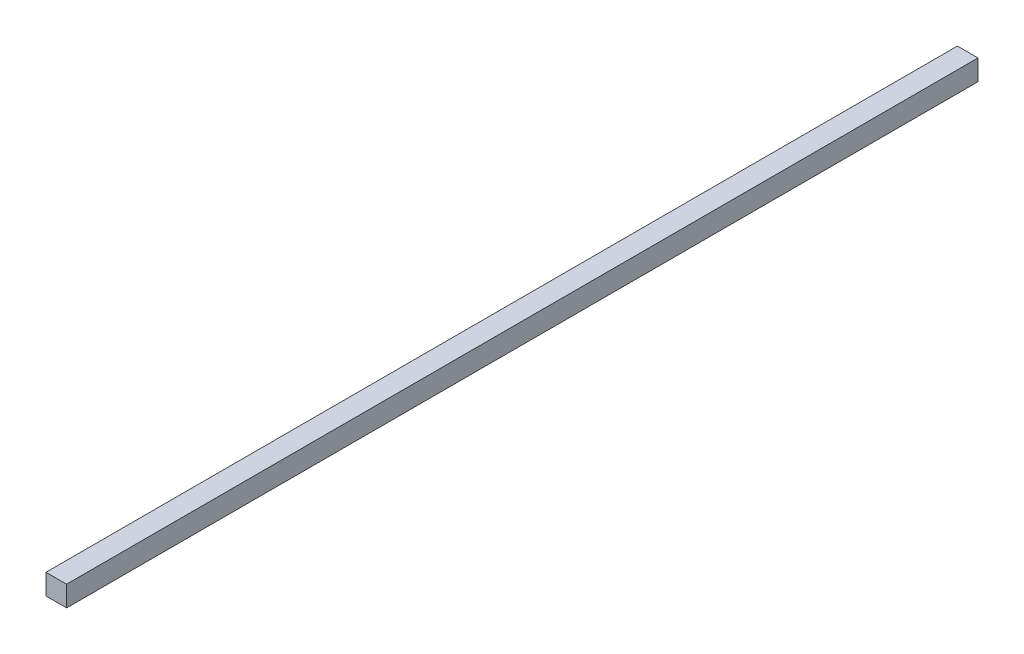
ISO-10303-21;
HEADER;
FILE_DESCRIPTION(('STEP AP214'),'2;1');
FILE_NAME('part.step','',(''),(''),'','','');
FILE_SCHEMA(('AUTOMOTIVE_DESIGN { 1 0 10303 214 1 1 1 1 }'));
ENDSEC;
DATA;
#1=APPLICATION_CONTEXT('core data for automotive mechanical design processes');
#2=APPLICATION_PROTOCOL_DEFINITION('international standard','automotive_design',2000,#1);
#3=PRODUCT_CONTEXT('',#1,'mechanical');
#4=PRODUCT('Part','Part','',(#3));
#5=PRODUCT_RELATED_PRODUCT_CATEGORY('part','',(#4));
#6=PRODUCT_DEFINITION_FORMATION('','',#4);
#7=PRODUCT_DEFINITION_CONTEXT('part definition',#1,'design');
#8=PRODUCT_DEFINITION('design','',#6,#7);
#9=PRODUCT_DEFINITION_SHAPE('','',#8);
#10=(LENGTH_UNIT() NAMED_UNIT(*) SI_UNIT(.MILLI.,.METRE.));
#11=(NAMED_UNIT(*) PLANE_ANGLE_UNIT() SI_UNIT($,.RADIAN.));
#12=(NAMED_UNIT(*) SI_UNIT($,.STERADIAN.) SOLID_ANGLE_UNIT());
#13=UNCERTAINTY_MEASURE_WITH_UNIT(LENGTH_MEASURE(1.E-05),#10,'distance_accuracy_value','');
#14=(GEOMETRIC_REPRESENTATION_CONTEXT(3) GLOBAL_UNCERTAINTY_ASSIGNED_CONTEXT((#13)) GLOBAL_UNIT_ASSIGNED_CONTEXT((#10,
#11,#12)) REPRESENTATION_CONTEXT('',''));
#15=CARTESIAN_POINT('',(0.,0.,0.));
#16=DIRECTION('',(0.,0.,1.));
#17=DIRECTION('',(1.,0.,0.));
#18=AXIS2_PLACEMENT_3D('',#15,#16,#17);
#19=CARTESIAN_POINT('',(744.799999999998,-44.4500000000014,2319.74204896855));
#20=DIRECTION('',(-1.,0.,0.));
#21=DIRECTION('',(0.,0.,1.));
#22=AXIS2_PLACEMENT_3D('',#19,#20,#21);
#23=PLANE('',#22);
#24=DIRECTION('',(0.,1.,0.));
#25=VECTOR('',#24,1.);
#26=CARTESIAN_POINT('',(744.799999999998,-44.4500000000012,2247.9));
#27=LINE('',#26,#25);
#28=CARTESIAN_POINT('',(744.799999999998,-44.4500000000006,2247.9));
#29=VERTEX_POINT('',#28);
#30=CARTESIAN_POINT('',(744.799999999998,6.34999999999861,2247.9));
#31=VERTEX_POINT('',#30);
#32=EDGE_CURVE('E102',#29,#31,#27,.T.);
#33=ORIENTED_EDGE('',*,*,#32,.F.);
#34=DIRECTION('',(0.,0.,-1.));
#35=VECTOR('',#34,1.);
#36=CARTESIAN_POINT('',(744.799999999998,-44.4500000000014,2319.74204896855));
#37=LINE('',#36,#35);
#38=CARTESIAN_POINT('',(744.799999999998,-44.4500000000014,0.));
#39=VERTEX_POINT('',#38);
#40=EDGE_CURVE('E92',#29,#39,#37,.T.);
#41=ORIENTED_EDGE('',*,*,#40,.T.);
#42=DIRECTION('',(0.,1.,0.));
#43=VECTOR('',#42,1.);
#44=CARTESIAN_POINT('',(744.799999999998,-44.4500000000014,0.));
#45=LINE('',#44,#43);
#46=CARTESIAN_POINT('',(744.799999999998,6.34999999999861,0.));
#47=VERTEX_POINT('',#46);
#48=EDGE_CURVE('E83',#39,#47,#45,.T.);
#49=ORIENTED_EDGE('',*,*,#48,.T.);
#50=DIRECTION('',(0.,0.,-1.));
#51=VECTOR('',#50,1.);
#52=CARTESIAN_POINT('',(744.799999999998,6.34999999999861,2319.74204896855));
#53=LINE('',#52,#51);
#54=EDGE_CURVE('E74',#31,#47,#53,.T.);
#55=ORIENTED_EDGE('',*,*,#54,.F.);
#56=EDGE_LOOP('',(#33,#41,#49,#55));
#57=FACE_BOUND('',#56,.T.);
#58=ADVANCED_FACE('F33',(#57),#23,.F.);
#59=CARTESIAN_POINT('',(744.799999999998,6.34999999999861,2319.74204896855));
#60=DIRECTION('',(0.,-1.,0.));
#61=DIRECTION('',(1.,0.,0.));
#62=AXIS2_PLACEMENT_3D('',#59,#60,#61);
#63=PLANE('',#62);
#64=DIRECTION('',(-1.,0.,0.));
#65=VECTOR('',#64,1.);
#66=CARTESIAN_POINT('',(744.799999999998,6.34999999999861,2247.9));
#67=LINE('',#66,#65);
#68=CARTESIAN_POINT('',(693.999999999998,6.34999999999861,2247.9));
#69=VERTEX_POINT('',#68);
#70=EDGE_CURVE('E80',#31,#69,#67,.T.);
#71=ORIENTED_EDGE('',*,*,#70,.F.);
#72=ORIENTED_EDGE('',*,*,#54,.T.);
#73=DIRECTION('',(-1.,0.,0.));
#74=VECTOR('',#73,1.);
#75=CARTESIAN_POINT('',(744.799999999998,6.34999999999861,0.));
#76=LINE('',#75,#74);
#77=CARTESIAN_POINT('',(693.999999999998,6.34999999999861,0.));
#78=VERTEX_POINT('',#77);
#79=EDGE_CURVE('E77',#47,#78,#76,.T.);
#80=ORIENTED_EDGE('',*,*,#79,.T.);
#81=DIRECTION('',(0.,0.,-1.));
#82=VECTOR('',#81,1.);
#83=CARTESIAN_POINT('',(693.999999999998,6.34999999999861,2319.74204896855));
#84=LINE('',#83,#82);
#85=EDGE_CURVE('E68',#69,#78,#84,.T.);
#86=ORIENTED_EDGE('',*,*,#85,.F.);
#87=EDGE_LOOP('',(#71,#72,#80,#86));
#88=FACE_BOUND('',#87,.T.);
#89=ADVANCED_FACE('F76',(#88),#63,.F.);
#90=CARTESIAN_POINT('',(693.999999999998,-44.4500000000014,2319.74204896855));
#91=DIRECTION('',(1.,0.,0.));
#92=DIRECTION('',(0.,0.,-1.));
#93=AXIS2_PLACEMENT_3D('',#90,#91,#92);
#94=PLANE('',#93);
#95=DIRECTION('',(0.,-1.,0.));
#96=VECTOR('',#95,1.);
#97=CARTESIAN_POINT('',(693.999999999998,-44.4500000000012,2247.9));
#98=LINE('',#97,#96);
#99=CARTESIAN_POINT('',(693.999999999998,-44.4500000000014,2247.9));
#100=VERTEX_POINT('',#99);
#101=EDGE_CURVE('E37',#69,#100,#98,.T.);
#102=ORIENTED_EDGE('',*,*,#101,.F.);
#103=ORIENTED_EDGE('',*,*,#85,.T.);
#104=DIRECTION('',(0.,-1.,0.));
#105=VECTOR('',#104,1.);
#106=CARTESIAN_POINT('',(693.999999999998,-44.4500000000014,0.));
#107=LINE('',#106,#105);
#108=CARTESIAN_POINT('',(693.999999999998,-44.4500000000014,0.));
#109=VERTEX_POINT('',#108);
#110=EDGE_CURVE('E89',#78,#109,#107,.T.);
#111=ORIENTED_EDGE('',*,*,#110,.T.);
#112=DIRECTION('',(0.,0.,-1.));
#113=VECTOR('',#112,1.);
#114=CARTESIAN_POINT('',(693.999999999998,-44.4500000000014,2319.74204896855));
#115=LINE('',#114,#113);
#116=EDGE_CURVE('E99',#100,#109,#115,.T.);
#117=ORIENTED_EDGE('',*,*,#116,.F.);
#118=EDGE_LOOP('',(#102,#103,#111,#117));
#119=FACE_BOUND('',#118,.T.);
#120=ADVANCED_FACE('F104',(#119),#94,.F.);
#121=CARTESIAN_POINT('',(744.799999999998,-44.4500000000014,2319.74204896855));
#122=DIRECTION('',(0.,1.,0.));
#123=DIRECTION('',(-1.,0.,0.));
#124=AXIS2_PLACEMENT_3D('',#121,#122,#123);
#125=PLANE('',#124);
#126=DIRECTION('',(1.,0.,0.));
#127=VECTOR('',#126,1.);
#128=CARTESIAN_POINT('',(744.799999999998,-44.4500000000014,2247.9));
#129=LINE('',#128,#127);
#130=EDGE_CURVE('E11',#100,#29,#129,.T.);
#131=ORIENTED_EDGE('',*,*,#130,.F.);
#132=ORIENTED_EDGE('',*,*,#116,.T.);
#133=DIRECTION('',(1.,0.,0.));
#134=VECTOR('',#133,1.);
#135=CARTESIAN_POINT('',(744.799999999998,-44.4500000000014,0.));
#136=LINE('',#135,#134);
#137=EDGE_CURVE('E100',#109,#39,#136,.T.);
#138=ORIENTED_EDGE('',*,*,#137,.T.);
#139=ORIENTED_EDGE('',*,*,#40,.F.);
#140=EDGE_LOOP('',(#131,#132,#138,#139));
#141=FACE_BOUND('',#140,.T.);
#142=ADVANCED_FACE('F106',(#141),#125,.F.);
#143=CARTESIAN_POINT('',(0.,0.,0.));
#144=DIRECTION('',(0.,0.,1.));
#145=DIRECTION('',(1.,0.,0.));
#146=AXIS2_PLACEMENT_3D('',#143,#144,#145);
#147=PLANE('',#146);
#148=ORIENTED_EDGE('',*,*,#48,.F.);
#149=ORIENTED_EDGE('',*,*,#137,.F.);
#150=ORIENTED_EDGE('',*,*,#110,.F.);
#151=ORIENTED_EDGE('',*,*,#79,.F.);
#152=EDGE_LOOP('',(#148,#149,#150,#151));
#153=FACE_BOUND('',#152,.T.);
#154=ADVANCED_FACE('F87',(#153),#147,.F.);
#155=CARTESIAN_POINT('',(-38.0999999999996,-44.4500000000008,2247.9));
#156=DIRECTION('',(0.,0.,1.));
#157=DIRECTION('',(0.,1.,0.));
#158=AXIS2_PLACEMENT_3D('',#155,#156,#157);
#159=PLANE('',#158);
#160=ORIENTED_EDGE('',*,*,#32,.T.);
#161=ORIENTED_EDGE('',*,*,#70,.T.);
#162=ORIENTED_EDGE('',*,*,#101,.T.);
#163=ORIENTED_EDGE('',*,*,#130,.T.);
#164=EDGE_LOOP('',(#160,#161,#162,#163));
#165=FACE_BOUND('',#164,.T.);
#166=ADVANCED_FACE('F35',(#165),#159,.T.);
#167=CLOSED_SHELL('',(#58,#89,#120,#142,#154,#166));
#168=MANIFOLD_SOLID_BREP('B2',#167);
#169=ADVANCED_BREP_SHAPE_REPRESENTATION('',(#18,#168),#14);
#170=SHAPE_DEFINITION_REPRESENTATION(#9,#169);
ENDSEC;
END-ISO-10303-21;
